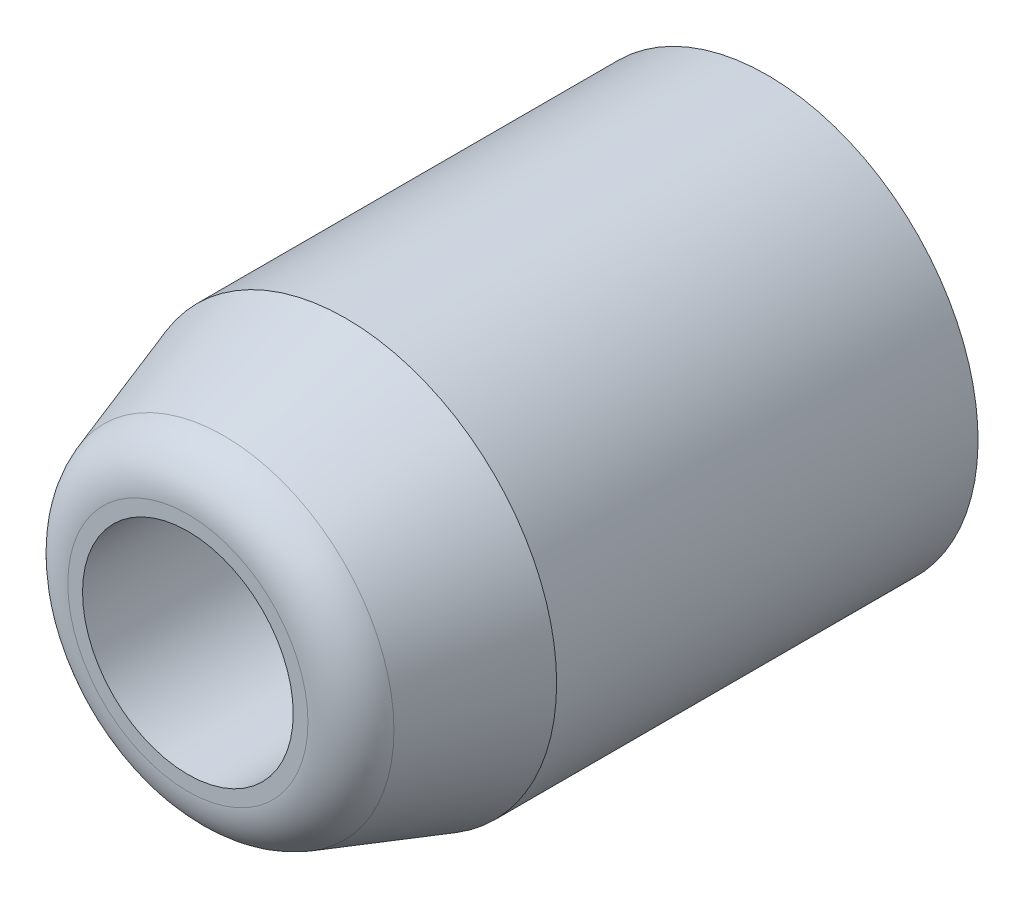
ISO-10303-21;
HEADER;
FILE_DESCRIPTION(('STEP AP214'),'2;1');
FILE_NAME('part.step','',(''),(''),'','','');
FILE_SCHEMA(('AUTOMOTIVE_DESIGN { 1 0 10303 214 1 1 1 1 }'));
ENDSEC;
DATA;
#1=APPLICATION_CONTEXT('core data for automotive mechanical design processes');
#2=APPLICATION_PROTOCOL_DEFINITION('international standard','automotive_design',2000,#1);
#3=PRODUCT_CONTEXT('',#1,'mechanical');
#4=PRODUCT('Part','Part','',(#3));
#5=PRODUCT_RELATED_PRODUCT_CATEGORY('part','',(#4));
#6=PRODUCT_DEFINITION_FORMATION('','',#4);
#7=PRODUCT_DEFINITION_CONTEXT('part definition',#1,'design');
#8=PRODUCT_DEFINITION('design','',#6,#7);
#9=PRODUCT_DEFINITION_SHAPE('','',#8);
#10=(LENGTH_UNIT() NAMED_UNIT(*) SI_UNIT(.MILLI.,.METRE.));
#11=(NAMED_UNIT(*) PLANE_ANGLE_UNIT() SI_UNIT($,.RADIAN.));
#12=(NAMED_UNIT(*) SI_UNIT($,.STERADIAN.) SOLID_ANGLE_UNIT());
#13=UNCERTAINTY_MEASURE_WITH_UNIT(LENGTH_MEASURE(1.E-05),#10,'distance_accuracy_value','');
#14=(GEOMETRIC_REPRESENTATION_CONTEXT(3) GLOBAL_UNCERTAINTY_ASSIGNED_CONTEXT((#13)) GLOBAL_UNIT_ASSIGNED_CONTEXT((#10,
#11,#12)) REPRESENTATION_CONTEXT('',''));
#15=CARTESIAN_POINT('',(0.,0.,0.));
#16=DIRECTION('',(0.,0.,1.));
#17=DIRECTION('',(1.,0.,0.));
#18=AXIS2_PLACEMENT_3D('',#15,#16,#17);
#19=CARTESIAN_POINT('',(0.,0.,0.));
#20=DIRECTION('',(0.,0.,1.));
#21=DIRECTION('',(1.,0.,0.));
#22=AXIS2_PLACEMENT_3D('',#19,#20,#21);
#23=PLANE('',#22);
#24=CARTESIAN_POINT('',(0.,0.,0.));
#25=DIRECTION('',(0.,0.,1.));
#26=DIRECTION('',(1.,0.,0.));
#27=AXIS2_PLACEMENT_3D('',#24,#25,#26);
#28=CIRCLE('',#27,3.);
#29=CARTESIAN_POINT('',(2.,-2.23606797749979,0.));
#30=VERTEX_POINT('',#29);
#31=CARTESIAN_POINT('',(-3.,0.,0.));
#32=VERTEX_POINT('',#31);
#33=EDGE_CURVE('E119',#30,#32,#28,.T.);
#34=ORIENTED_EDGE('',*,*,#33,.T.);
#35=DIRECTION('',(0.,1.,0.));
#36=VECTOR('',#35,1.);
#37=CARTESIAN_POINT('',(-3.,-6.,0.));
#38=LINE('',#37,#36);
#39=CARTESIAN_POINT('',(-3.,-2.64575131106459,0.));
#40=VERTEX_POINT('',#39);
#41=EDGE_CURVE('E56',#40,#32,#38,.T.);
#42=ORIENTED_EDGE('',*,*,#41,.F.);
#43=CARTESIAN_POINT('',(0.,0.,0.));
#44=DIRECTION('',(0.,0.,1.));
#45=DIRECTION('',(1.,0.,0.));
#46=AXIS2_PLACEMENT_3D('',#43,#44,#45);
#47=CIRCLE('',#46,4.);
#48=CARTESIAN_POINT('',(2.,-3.46410161513775,0.));
#49=VERTEX_POINT('',#48);
#50=EDGE_CURVE('E115',#49,#40,#47,.T.);
#51=ORIENTED_EDGE('',*,*,#50,.F.);
#52=DIRECTION('',(0.,1.,0.));
#53=VECTOR('',#52,1.);
#54=CARTESIAN_POINT('',(2.,-6.,0.));
#55=LINE('',#54,#53);
#56=EDGE_CURVE('E144',#49,#30,#55,.T.);
#57=ORIENTED_EDGE('',*,*,#56,.T.);
#58=EDGE_LOOP('',(#34,#42,#51,#57));
#59=FACE_BOUND('',#58,.T.);
#60=ADVANCED_FACE('F40',(#59),#23,.F.);
#61=CARTESIAN_POINT('',(0.,0.,8.));
#62=DIRECTION('',(0.,0.,-1.));
#63=DIRECTION('',(-1.,0.,0.));
#64=AXIS2_PLACEMENT_3D('',#61,#62,#63);
#65=CYLINDRICAL_SURFACE('',#64,4.);
#66=ORIENTED_EDGE('',*,*,#50,.T.);
#67=DIRECTION('',(0.,0.,-1.));
#68=VECTOR('',#67,1.);
#69=CARTESIAN_POINT('',(-3.,-2.64575131106459,8.));
#70=LINE('',#69,#68);
#71=CARTESIAN_POINT('',(-3.,-2.64575131106459,2.));
#72=VERTEX_POINT('',#71);
#73=EDGE_CURVE('E61',#40,#72,#70,.F.);
#74=ORIENTED_EDGE('',*,*,#73,.T.);
#75=CARTESIAN_POINT('',(0.,0.,2.));
#76=DIRECTION('',(0.,0.,1.));
#77=DIRECTION('',(1.,0.,0.));
#78=AXIS2_PLACEMENT_3D('',#75,#76,#77);
#79=CIRCLE('',#78,4.);
#80=CARTESIAN_POINT('',(2.,-3.46410161513775,2.));
#81=VERTEX_POINT('',#80);
#82=EDGE_CURVE('E85',#72,#81,#79,.T.);
#83=ORIENTED_EDGE('',*,*,#82,.T.);
#84=DIRECTION('',(0.,0.,-1.));
#85=VECTOR('',#84,1.);
#86=CARTESIAN_POINT('',(2.,-3.46410161513775,8.));
#87=LINE('',#86,#85);
#88=EDGE_CURVE('E136',#81,#49,#87,.T.);
#89=ORIENTED_EDGE('',*,*,#88,.T.);
#90=EDGE_LOOP('',(#66,#74,#83,#89));
#91=FACE_BOUND('',#90,.T.);
#92=CARTESIAN_POINT('',(0.,0.,8.));
#93=DIRECTION('',(0.,0.,-1.));
#94=DIRECTION('',(-1.,0.,0.));
#95=AXIS2_PLACEMENT_3D('',#92,#93,#94);
#96=CIRCLE('',#95,4.);
#97=CARTESIAN_POINT('',(-4.,0.,8.));
#98=VERTEX_POINT('',#97);
#99=EDGE_CURVE('E109',#98,#98,#96,.F.);
#100=ORIENTED_EDGE('',*,*,#99,.F.);
#101=EDGE_LOOP('',(#100));
#102=FACE_BOUND('',#101,.T.);
#103=ADVANCED_FACE('F154',(#91,#102),#65,.T.);
#104=CARTESIAN_POINT('',(0.,0.,8.));
#105=DIRECTION('',(0.,0.,-1.));
#106=DIRECTION('',(-1.,0.,0.));
#107=AXIS2_PLACEMENT_3D('',#104,#105,#106);
#108=CYLINDRICAL_SURFACE('',#107,3.);
#109=DIRECTION('',(0.,0.,-1.));
#110=VECTOR('',#109,1.);
#111=CARTESIAN_POINT('',(2.,-2.23606797749979,8.));
#112=LINE('',#111,#110);
#113=CARTESIAN_POINT('',(2.,-2.23606797749979,2.));
#114=VERTEX_POINT('',#113);
#115=EDGE_CURVE('E12',#114,#30,#112,.T.);
#116=ORIENTED_EDGE('',*,*,#115,.F.);
#117=CARTESIAN_POINT('',(0.,0.,2.));
#118=DIRECTION('',(0.,0.,1.));
#119=DIRECTION('',(1.,0.,0.));
#120=AXIS2_PLACEMENT_3D('',#117,#118,#119);
#121=CIRCLE('',#120,3.);
#122=CARTESIAN_POINT('',(-3.,0.,2.));
#123=VERTEX_POINT('',#122);
#124=EDGE_CURVE('E49',#123,#114,#121,.T.);
#125=ORIENTED_EDGE('',*,*,#124,.F.);
#126=DIRECTION('',(0.,0.,1.));
#127=VECTOR('',#126,1.);
#128=CARTESIAN_POINT('',(-3.,0.,0.));
#129=LINE('',#128,#127);
#130=EDGE_CURVE('E88',#32,#123,#129,.T.);
#131=ORIENTED_EDGE('',*,*,#130,.F.);
#132=ORIENTED_EDGE('',*,*,#33,.F.);
#133=EDGE_LOOP('',(#116,#125,#131,#132));
#134=FACE_BOUND('',#133,.T.);
#135=CARTESIAN_POINT('',(0.,0.,8.));
#136=DIRECTION('',(0.,0.,1.));
#137=DIRECTION('',(1.,0.,0.));
#138=AXIS2_PLACEMENT_3D('',#135,#136,#137);
#139=CIRCLE('',#138,3.);
#140=CARTESIAN_POINT('',(3.,0.,8.));
#141=VERTEX_POINT('',#140);
#142=EDGE_CURVE('E122',#141,#141,#139,.T.);
#143=ORIENTED_EDGE('',*,*,#142,.T.);
#144=EDGE_LOOP('',(#143));
#145=FACE_BOUND('',#144,.T.);
#146=ADVANCED_FACE('F97',(#134,#145),#108,.F.);
#147=CARTESIAN_POINT('',(0.,0.,8.));
#148=DIRECTION('',(0.,0.,1.));
#149=DIRECTION('',(1.,0.,0.));
#150=AXIS2_PLACEMENT_3D('',#147,#148,#149);
#151=PLANE('',#150);
#152=CARTESIAN_POINT('',(0.,0.,8.));
#153=DIRECTION('',(0.,0.,1.));
#154=DIRECTION('',(1.,0.,0.));
#155=AXIS2_PLACEMENT_3D('',#152,#153,#154);
#156=CIRCLE('',#155,2.);
#157=CARTESIAN_POINT('',(2.,0.,8.));
#158=VERTEX_POINT('',#157);
#159=EDGE_CURVE('E126',#158,#158,#156,.T.);
#160=ORIENTED_EDGE('',*,*,#159,.T.);
#161=EDGE_LOOP('',(#160));
#162=FACE_BOUND('',#161,.T.);
#163=ORIENTED_EDGE('',*,*,#142,.F.);
#164=EDGE_LOOP('',(#163));
#165=FACE_BOUND('',#164,.T.);
#166=ADVANCED_FACE('F171',(#162,#165),#151,.F.);
#167=CARTESIAN_POINT('',(0.,0.,11.));
#168=DIRECTION('',(0.,0.,1.));
#169=DIRECTION('',(1.,0.,0.));
#170=AXIS2_PLACEMENT_3D('',#167,#168,#169);
#171=PLANE('',#170);
#172=CARTESIAN_POINT('',(0.,0.,11.));
#173=DIRECTION('',(0.,0.,1.));
#174=DIRECTION('',(1.,0.,0.));
#175=AXIS2_PLACEMENT_3D('',#172,#173,#174);
#176=CIRCLE('',#175,2.27924077994387);
#177=CARTESIAN_POINT('',(2.27924077994387,0.,11.));
#178=VERTEX_POINT('',#177);
#179=EDGE_CURVE('E103',#178,#178,#176,.T.);
#180=ORIENTED_EDGE('',*,*,#179,.T.);
#181=EDGE_LOOP('',(#180));
#182=FACE_BOUND('',#181,.T.);
#183=CARTESIAN_POINT('',(0.,0.,11.));
#184=DIRECTION('',(0.,0.,1.));
#185=DIRECTION('',(1.,0.,0.));
#186=AXIS2_PLACEMENT_3D('',#183,#184,#185);
#187=CIRCLE('',#186,2.);
#188=CARTESIAN_POINT('',(2.,0.,11.));
#189=VERTEX_POINT('',#188);
#190=EDGE_CURVE('E130',#189,#189,#187,.T.);
#191=ORIENTED_EDGE('',*,*,#190,.F.);
#192=EDGE_LOOP('',(#191));
#193=FACE_BOUND('',#192,.T.);
#194=ADVANCED_FACE('F162',(#182,#193),#171,.T.);
#195=CARTESIAN_POINT('',(0.,0.,11.));
#196=DIRECTION('',(0.,0.,-1.));
#197=DIRECTION('',(-1.,0.,0.));
#198=AXIS2_PLACEMENT_3D('',#195,#196,#197);
#199=CONICAL_SURFACE('',#198,3.,0.321750554396642);
#200=CARTESIAN_POINT('',(0.,0.,10.3162277660168));
#201=DIRECTION('',(0.,0.,1.));
#202=DIRECTION('',(1.,0.,0.));
#203=AXIS2_PLACEMENT_3D('',#200,#201,#202);
#204=CIRCLE('',#203,3.22792407799439);
#205=CARTESIAN_POINT('',(3.22792407799439,0.,10.3162277660168));
#206=VERTEX_POINT('',#205);
#207=EDGE_CURVE('E100',#206,#206,#204,.F.);
#208=ORIENTED_EDGE('',*,*,#207,.T.);
#209=EDGE_LOOP('',(#208));
#210=FACE_BOUND('',#209,.T.);
#211=ORIENTED_EDGE('',*,*,#99,.T.);
#212=EDGE_LOOP('',(#211));
#213=FACE_BOUND('',#212,.T.);
#214=ADVANCED_FACE('F159',(#210,#213),#199,.T.);
#215=CARTESIAN_POINT('',(0.,0.,0.));
#216=DIRECTION('',(0.,0.,1.));
#217=DIRECTION('',(1.,0.,0.));
#218=AXIS2_PLACEMENT_3D('',#215,#216,#217);
#219=CYLINDRICAL_SURFACE('',#218,2.);
#220=ORIENTED_EDGE('',*,*,#190,.T.);
#221=EDGE_LOOP('',(#220));
#222=FACE_BOUND('',#221,.T.);
#223=ORIENTED_EDGE('',*,*,#159,.F.);
#224=EDGE_LOOP('',(#223));
#225=FACE_BOUND('',#224,.T.);
#226=ADVANCED_FACE('F161',(#222,#225),#219,.F.);
#227=CARTESIAN_POINT('',(0.,0.,10.));
#228=DIRECTION('',(0.,0.,1.));
#229=DIRECTION('',(1.,0.,0.));
#230=AXIS2_PLACEMENT_3D('',#227,#228,#229);
#231=TOROIDAL_SURFACE('',#230,2.27924077994387,1.);
#232=ORIENTED_EDGE('',*,*,#207,.F.);
#233=EDGE_LOOP('',(#232));
#234=FACE_BOUND('',#233,.T.);
#235=ORIENTED_EDGE('',*,*,#179,.F.);
#236=EDGE_LOOP('',(#235));
#237=FACE_BOUND('',#236,.T.);
#238=ADVANCED_FACE('F42',(#234,#237),#231,.T.);
#239=CARTESIAN_POINT('',(-3.,-6.,0.));
#240=DIRECTION('',(-1.,0.,0.));
#241=DIRECTION('',(0.,0.,1.));
#242=AXIS2_PLACEMENT_3D('',#239,#240,#241);
#243=PLANE('',#242);
#244=ORIENTED_EDGE('',*,*,#41,.T.);
#245=ORIENTED_EDGE('',*,*,#130,.T.);
#246=DIRECTION('',(0.,1.,0.));
#247=VECTOR('',#246,1.);
#248=CARTESIAN_POINT('',(-3.,-6.,2.));
#249=LINE('',#248,#247);
#250=EDGE_CURVE('E79',#72,#123,#249,.T.);
#251=ORIENTED_EDGE('',*,*,#250,.F.);
#252=ORIENTED_EDGE('',*,*,#73,.F.);
#253=EDGE_LOOP('',(#244,#245,#251,#252));
#254=FACE_BOUND('',#253,.T.);
#255=ADVANCED_FACE('F90',(#254),#243,.F.);
#256=CARTESIAN_POINT('',(2.,-6.,0.));
#257=DIRECTION('',(1.,0.,0.));
#258=DIRECTION('',(0.,0.,-1.));
#259=AXIS2_PLACEMENT_3D('',#256,#257,#258);
#260=PLANE('',#259);
#261=DIRECTION('',(0.,1.,0.));
#262=VECTOR('',#261,1.);
#263=CARTESIAN_POINT('',(2.,-6.,2.));
#264=LINE('',#263,#262);
#265=EDGE_CURVE('E87',#81,#114,#264,.T.);
#266=ORIENTED_EDGE('',*,*,#265,.T.);
#267=ORIENTED_EDGE('',*,*,#115,.T.);
#268=ORIENTED_EDGE('',*,*,#56,.F.);
#269=ORIENTED_EDGE('',*,*,#88,.F.);
#270=EDGE_LOOP('',(#266,#267,#268,#269));
#271=FACE_BOUND('',#270,.T.);
#272=ADVANCED_FACE('F152',(#271),#260,.F.);
#273=CARTESIAN_POINT('',(-3.,-6.,2.));
#274=DIRECTION('',(0.,0.,1.));
#275=DIRECTION('',(1.,0.,0.));
#276=AXIS2_PLACEMENT_3D('',#273,#274,#275);
#277=PLANE('',#276);
#278=ORIENTED_EDGE('',*,*,#250,.T.);
#279=ORIENTED_EDGE('',*,*,#124,.T.);
#280=ORIENTED_EDGE('',*,*,#265,.F.);
#281=ORIENTED_EDGE('',*,*,#82,.F.);
#282=EDGE_LOOP('',(#278,#279,#280,#281));
#283=FACE_BOUND('',#282,.T.);
#284=ADVANCED_FACE('F80',(#283),#277,.F.);
#285=CLOSED_SHELL('',(#60,#103,#146,#166,#194,#214,#226,#238,#255,#272,#284));
#286=MANIFOLD_SOLID_BREP('B2',#285);
#287=ADVANCED_BREP_SHAPE_REPRESENTATION('',(#18,#286),#14);
#288=SHAPE_DEFINITION_REPRESENTATION(#9,#287);
ENDSEC;
END-ISO-10303-21;
